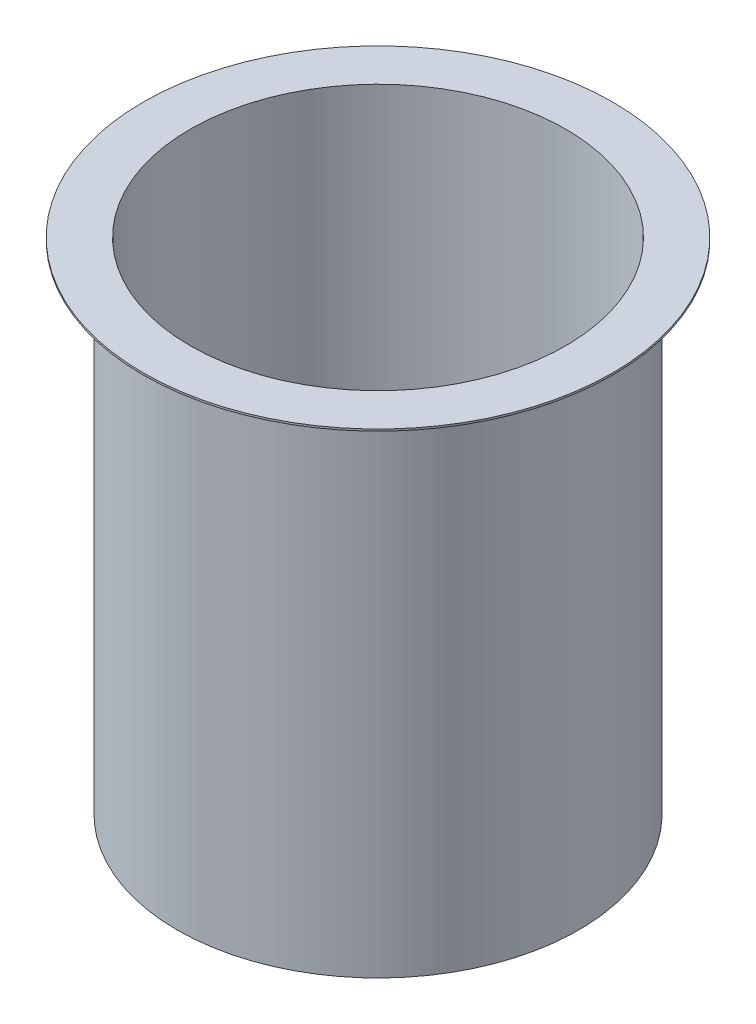
ISO-10303-21;
HEADER;
FILE_DESCRIPTION(('STEP AP214'),'2;1');
FILE_NAME('part.step','',(''),(''),'','','');
FILE_SCHEMA(('AUTOMOTIVE_DESIGN { 1 0 10303 214 1 1 1 1 }'));
ENDSEC;
DATA;
#1=APPLICATION_CONTEXT('core data for automotive mechanical design processes');
#2=APPLICATION_PROTOCOL_DEFINITION('international standard','automotive_design',2000,#1);
#3=PRODUCT_CONTEXT('',#1,'mechanical');
#4=PRODUCT('Part','Part','',(#3));
#5=PRODUCT_RELATED_PRODUCT_CATEGORY('part','',(#4));
#6=PRODUCT_DEFINITION_FORMATION('','',#4);
#7=PRODUCT_DEFINITION_CONTEXT('part definition',#1,'design');
#8=PRODUCT_DEFINITION('design','',#6,#7);
#9=PRODUCT_DEFINITION_SHAPE('','',#8);
#10=(LENGTH_UNIT() NAMED_UNIT(*) SI_UNIT(.MILLI.,.METRE.));
#11=(NAMED_UNIT(*) PLANE_ANGLE_UNIT() SI_UNIT($,.RADIAN.));
#12=(NAMED_UNIT(*) SI_UNIT($,.STERADIAN.) SOLID_ANGLE_UNIT());
#13=UNCERTAINTY_MEASURE_WITH_UNIT(LENGTH_MEASURE(1.E-05),#10,'distance_accuracy_value','');
#14=(GEOMETRIC_REPRESENTATION_CONTEXT(3) GLOBAL_UNCERTAINTY_ASSIGNED_CONTEXT((#13)) GLOBAL_UNIT_ASSIGNED_CONTEXT((#10,
#11,#12)) REPRESENTATION_CONTEXT('',''));
#15=CARTESIAN_POINT('',(0.,0.,0.));
#16=DIRECTION('',(0.,0.,1.));
#17=DIRECTION('',(1.,0.,0.));
#18=AXIS2_PLACEMENT_3D('',#15,#16,#17);
#19=CARTESIAN_POINT('',(0.,0.,0.));
#20=DIRECTION('',(0.,1.,0.));
#21=DIRECTION('',(0.,0.,1.));
#22=AXIS2_PLACEMENT_3D('',#19,#20,#21);
#23=PLANE('',#22);
#24=CARTESIAN_POINT('',(0.,0.,0.));
#25=DIRECTION('',(0.,1.,0.));
#26=DIRECTION('',(0.,0.,1.));
#27=AXIS2_PLACEMENT_3D('',#24,#25,#26);
#28=CIRCLE('',#27,27.178);
#29=CARTESIAN_POINT('',(0.,0.,27.178));
#30=VERTEX_POINT('',#29);
#31=EDGE_CURVE('E41',#30,#30,#28,.T.);
#32=ORIENTED_EDGE('',*,*,#31,.F.);
#33=EDGE_LOOP('',(#32));
#34=FACE_BOUND('',#33,.T.);
#35=CARTESIAN_POINT('',(0.,0.,0.));
#36=DIRECTION('',(0.,1.,0.));
#37=DIRECTION('',(0.,0.,1.));
#38=AXIS2_PLACEMENT_3D('',#35,#36,#37);
#39=CIRCLE('',#38,25.4);
#40=CARTESIAN_POINT('',(0.,0.,25.4));
#41=VERTEX_POINT('',#40);
#42=EDGE_CURVE('E50',#41,#41,#39,.T.);
#43=ORIENTED_EDGE('',*,*,#42,.T.);
#44=EDGE_LOOP('',(#43));
#45=FACE_BOUND('',#44,.T.);
#46=ADVANCED_FACE('F37',(#34,#45),#23,.F.);
#47=CARTESIAN_POINT('',(0.,67.31,0.));
#48=DIRECTION('',(0.,-1.,0.));
#49=DIRECTION('',(0.,0.,-1.));
#50=AXIS2_PLACEMENT_3D('',#47,#48,#49);
#51=CYLINDRICAL_SURFACE('',#50,27.178);
#52=CARTESIAN_POINT('',(0.,67.31,0.));
#53=DIRECTION('',(0.,1.,0.));
#54=DIRECTION('',(0.,0.,1.));
#55=AXIS2_PLACEMENT_3D('',#52,#53,#54);
#56=CIRCLE('',#55,27.178);
#57=CARTESIAN_POINT('',(0.,67.31,27.178));
#58=VERTEX_POINT('',#57);
#59=EDGE_CURVE('E10',#58,#58,#56,.T.);
#60=ORIENTED_EDGE('',*,*,#59,.F.);
#61=EDGE_LOOP('',(#60));
#62=FACE_BOUND('',#61,.T.);
#63=ORIENTED_EDGE('',*,*,#31,.T.);
#64=EDGE_LOOP('',(#63));
#65=FACE_BOUND('',#64,.T.);
#66=ADVANCED_FACE('F39',(#62,#65),#51,.T.);
#67=CARTESIAN_POINT('',(0.,67.31,0.));
#68=DIRECTION('',(0.,-1.,0.));
#69=DIRECTION('',(0.,0.,-1.));
#70=AXIS2_PLACEMENT_3D('',#67,#68,#69);
#71=CYLINDRICAL_SURFACE('',#70,25.4);
#72=ORIENTED_EDGE('',*,*,#42,.F.);
#73=EDGE_LOOP('',(#72));
#74=FACE_BOUND('',#73,.T.);
#75=CARTESIAN_POINT('',(0.,67.564,0.));
#76=DIRECTION('',(0.,1.,0.));
#77=DIRECTION('',(0.,0.,1.));
#78=AXIS2_PLACEMENT_3D('',#75,#76,#77);
#79=CIRCLE('',#78,25.4);
#80=CARTESIAN_POINT('',(0.,67.564,25.4));
#81=VERTEX_POINT('',#80);
#82=EDGE_CURVE('E60',#81,#81,#79,.T.);
#83=ORIENTED_EDGE('',*,*,#82,.T.);
#84=EDGE_LOOP('',(#83));
#85=FACE_BOUND('',#84,.T.);
#86=ADVANCED_FACE('F68',(#74,#85),#71,.F.);
#87=CARTESIAN_POINT('',(0.,67.564,0.));
#88=DIRECTION('',(0.,1.,0.));
#89=DIRECTION('',(0.,0.,1.));
#90=AXIS2_PLACEMENT_3D('',#87,#88,#89);
#91=PLANE('',#90);
#92=CARTESIAN_POINT('',(0.,67.564,0.));
#93=DIRECTION('',(0.,1.,0.));
#94=DIRECTION('',(0.,0.,1.));
#95=AXIS2_PLACEMENT_3D('',#92,#93,#94);
#96=CIRCLE('',#95,31.75);
#97=CARTESIAN_POINT('',(0.,67.564,31.75));
#98=VERTEX_POINT('',#97);
#99=EDGE_CURVE('E55',#98,#98,#96,.T.);
#100=ORIENTED_EDGE('',*,*,#99,.T.);
#101=EDGE_LOOP('',(#100));
#102=FACE_BOUND('',#101,.T.);
#103=ORIENTED_EDGE('',*,*,#82,.F.);
#104=EDGE_LOOP('',(#103));
#105=FACE_BOUND('',#104,.T.);
#106=ADVANCED_FACE('F70',(#102,#105),#91,.T.);
#107=CARTESIAN_POINT('',(0.,67.31,0.));
#108=DIRECTION('',(0.,1.,0.));
#109=DIRECTION('',(0.,0.,1.));
#110=AXIS2_PLACEMENT_3D('',#107,#108,#109);
#111=PLANE('',#110);
#112=ORIENTED_EDGE('',*,*,#59,.T.);
#113=EDGE_LOOP('',(#112));
#114=FACE_BOUND('',#113,.T.);
#115=CARTESIAN_POINT('',(0.,67.31,0.));
#116=DIRECTION('',(0.,1.,0.));
#117=DIRECTION('',(0.,0.,1.));
#118=AXIS2_PLACEMENT_3D('',#115,#116,#117);
#119=CIRCLE('',#118,31.75);
#120=CARTESIAN_POINT('',(0.,67.31,31.75));
#121=VERTEX_POINT('',#120);
#122=EDGE_CURVE('E56',#121,#121,#119,.T.);
#123=ORIENTED_EDGE('',*,*,#122,.F.);
#124=EDGE_LOOP('',(#123));
#125=FACE_BOUND('',#124,.T.);
#126=ADVANCED_FACE('F72',(#114,#125),#111,.F.);
#127=CARTESIAN_POINT('',(0.,67.564,0.));
#128=DIRECTION('',(0.,-1.,0.));
#129=DIRECTION('',(0.,0.,-1.));
#130=AXIS2_PLACEMENT_3D('',#127,#128,#129);
#131=CYLINDRICAL_SURFACE('',#130,31.75);
#132=ORIENTED_EDGE('',*,*,#99,.F.);
#133=EDGE_LOOP('',(#132));
#134=FACE_BOUND('',#133,.T.);
#135=ORIENTED_EDGE('',*,*,#122,.T.);
#136=EDGE_LOOP('',(#135));
#137=FACE_BOUND('',#136,.T.);
#138=ADVANCED_FACE('F79',(#134,#137),#131,.T.);
#139=CLOSED_SHELL('',(#46,#66,#86,#106,#126,#138));
#140=MANIFOLD_SOLID_BREP('B2',#139);
#141=ADVANCED_BREP_SHAPE_REPRESENTATION('',(#18,#140),#14);
#142=SHAPE_DEFINITION_REPRESENTATION(#9,#141);
ENDSEC;
END-ISO-10303-21;
